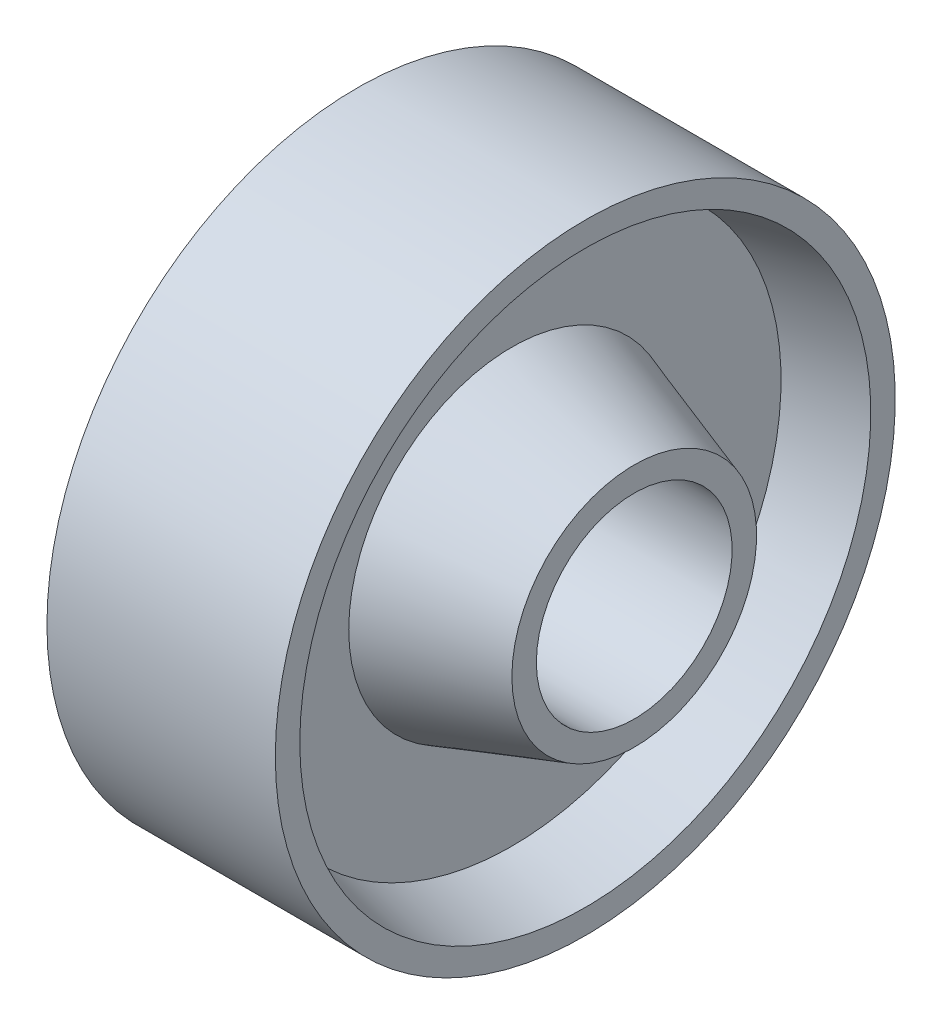
ISO-10303-21;
HEADER;
FILE_DESCRIPTION(('STEP AP214'),'2;1');
FILE_NAME('part.step','',(''),(''),'','','');
FILE_SCHEMA(('AUTOMOTIVE_DESIGN { 1 0 10303 214 1 1 1 1 }'));
ENDSEC;
DATA;
#1=APPLICATION_CONTEXT('core data for automotive mechanical design processes');
#2=APPLICATION_PROTOCOL_DEFINITION('international standard','automotive_design',2000,#1);
#3=PRODUCT_CONTEXT('',#1,'mechanical');
#4=PRODUCT('Part','Part','',(#3));
#5=PRODUCT_RELATED_PRODUCT_CATEGORY('part','',(#4));
#6=PRODUCT_DEFINITION_FORMATION('','',#4);
#7=PRODUCT_DEFINITION_CONTEXT('part definition',#1,'design');
#8=PRODUCT_DEFINITION('design','',#6,#7);
#9=PRODUCT_DEFINITION_SHAPE('','',#8);
#10=(LENGTH_UNIT() NAMED_UNIT(*) SI_UNIT(.MILLI.,.METRE.));
#11=(NAMED_UNIT(*) PLANE_ANGLE_UNIT() SI_UNIT($,.RADIAN.));
#12=(NAMED_UNIT(*) SI_UNIT($,.STERADIAN.) SOLID_ANGLE_UNIT());
#13=UNCERTAINTY_MEASURE_WITH_UNIT(LENGTH_MEASURE(1.E-05),#10,'distance_accuracy_value','');
#14=(GEOMETRIC_REPRESENTATION_CONTEXT(3) GLOBAL_UNCERTAINTY_ASSIGNED_CONTEXT((#13)) GLOBAL_UNIT_ASSIGNED_CONTEXT((#10,
#11,#12)) REPRESENTATION_CONTEXT('',''));
#15=CARTESIAN_POINT('',(0.,0.,0.));
#16=DIRECTION('',(0.,0.,1.));
#17=DIRECTION('',(1.,0.,0.));
#18=AXIS2_PLACEMENT_3D('',#15,#16,#17);
#19=CARTESIAN_POINT('',(-20.,0.,0.));
#20=DIRECTION('',(1.,0.,0.));
#21=DIRECTION('',(0.,0.,-1.));
#22=AXIS2_PLACEMENT_3D('',#19,#20,#21);
#23=PLANE('',#22);
#24=CARTESIAN_POINT('',(-20.,-12.,0.));
#25=DIRECTION('',(-1.,0.,0.));
#26=DIRECTION('',(0.,0.,1.));
#27=AXIS2_PLACEMENT_3D('',#24,#25,#26);
#28=CIRCLE('',#27,12.);
#29=CARTESIAN_POINT('',(-20.,-12.,12.));
#30=VERTEX_POINT('',#29);
#31=EDGE_CURVE('E10',#30,#30,#28,.T.);
#32=ORIENTED_EDGE('',*,*,#31,.F.);
#33=EDGE_LOOP('',(#32));
#34=FACE_BOUND('',#33,.T.);
#35=CARTESIAN_POINT('',(-20.,-12.,0.));
#36=DIRECTION('',(-1.,0.,0.));
#37=DIRECTION('',(0.,0.,1.));
#38=AXIS2_PLACEMENT_3D('',#35,#36,#37);
#39=CIRCLE('',#38,15.);
#40=CARTESIAN_POINT('',(-20.,-12.,15.));
#41=VERTEX_POINT('',#40);
#42=EDGE_CURVE('E40',#41,#41,#39,.T.);
#43=ORIENTED_EDGE('',*,*,#42,.T.);
#44=EDGE_LOOP('',(#43));
#45=FACE_BOUND('',#44,.T.);
#46=ADVANCED_FACE('F34',(#34,#45),#23,.F.);
#47=CARTESIAN_POINT('',(-5.,-12.,0.));
#48=DIRECTION('',(1.,0.,0.));
#49=DIRECTION('',(0.,0.,-1.));
#50=AXIS2_PLACEMENT_3D('',#47,#48,#49);
#51=CONICAL_SURFACE('',#50,20.,0.321750554396642);
#52=ORIENTED_EDGE('',*,*,#42,.F.);
#53=EDGE_LOOP('',(#52));
#54=FACE_BOUND('',#53,.T.);
#55=CARTESIAN_POINT('',(-5.,-12.,0.));
#56=DIRECTION('',(-1.,0.,0.));
#57=DIRECTION('',(0.,0.,1.));
#58=AXIS2_PLACEMENT_3D('',#55,#56,#57);
#59=CIRCLE('',#58,20.);
#60=CARTESIAN_POINT('',(-5.,-12.,20.));
#61=VERTEX_POINT('',#60);
#62=EDGE_CURVE('E44',#61,#61,#59,.T.);
#63=ORIENTED_EDGE('',*,*,#62,.T.);
#64=EDGE_LOOP('',(#63));
#65=FACE_BOUND('',#64,.T.);
#66=ADVANCED_FACE('F90',(#54,#65),#51,.T.);
#67=CARTESIAN_POINT('',(-5.,21.,0.));
#68=DIRECTION('',(1.,0.,0.));
#69=DIRECTION('',(0.,0.,-1.));
#70=AXIS2_PLACEMENT_3D('',#67,#68,#69);
#71=PLANE('',#70);
#72=ORIENTED_EDGE('',*,*,#62,.F.);
#73=EDGE_LOOP('',(#72));
#74=FACE_BOUND('',#73,.T.);
#75=CARTESIAN_POINT('',(-5.,-12.,0.));
#76=DIRECTION('',(-1.,0.,0.));
#77=DIRECTION('',(0.,0.,1.));
#78=AXIS2_PLACEMENT_3D('',#75,#76,#77);
#79=CIRCLE('',#78,33.);
#80=CARTESIAN_POINT('',(-5.,-12.,33.));
#81=VERTEX_POINT('',#80);
#82=EDGE_CURVE('E48',#81,#81,#79,.T.);
#83=ORIENTED_EDGE('',*,*,#82,.T.);
#84=EDGE_LOOP('',(#83));
#85=FACE_BOUND('',#84,.T.);
#86=ADVANCED_FACE('F95',(#74,#85),#71,.F.);
#87=CARTESIAN_POINT('',(-14.,-12.,0.));
#88=DIRECTION('',(-1.,0.,0.));
#89=DIRECTION('',(0.,0.,1.));
#90=AXIS2_PLACEMENT_3D('',#87,#88,#89);
#91=CONICAL_SURFACE('',#90,35.,0.218668945873942);
#92=ORIENTED_EDGE('',*,*,#82,.F.);
#93=EDGE_LOOP('',(#92));
#94=FACE_BOUND('',#93,.T.);
#95=CARTESIAN_POINT('',(-14.,-12.,0.));
#96=DIRECTION('',(-1.,0.,0.));
#97=DIRECTION('',(0.,0.,1.));
#98=AXIS2_PLACEMENT_3D('',#95,#96,#97);
#99=CIRCLE('',#98,35.);
#100=CARTESIAN_POINT('',(-14.,-12.,35.));
#101=VERTEX_POINT('',#100);
#102=EDGE_CURVE('E53',#101,#101,#99,.T.);
#103=ORIENTED_EDGE('',*,*,#102,.T.);
#104=EDGE_LOOP('',(#103));
#105=FACE_BOUND('',#104,.T.);
#106=ADVANCED_FACE('F100',(#94,#105),#91,.F.);
#107=CARTESIAN_POINT('',(-14.,26.,0.));
#108=DIRECTION('',(1.,0.,0.));
#109=DIRECTION('',(0.,0.,-1.));
#110=AXIS2_PLACEMENT_3D('',#107,#108,#109);
#111=PLANE('',#110);
#112=ORIENTED_EDGE('',*,*,#102,.F.);
#113=EDGE_LOOP('',(#112));
#114=FACE_BOUND('',#113,.T.);
#115=CARTESIAN_POINT('',(-14.,-12.,0.));
#116=DIRECTION('',(-1.,0.,0.));
#117=DIRECTION('',(0.,0.,1.));
#118=AXIS2_PLACEMENT_3D('',#115,#116,#117);
#119=CIRCLE('',#118,38.);
#120=CARTESIAN_POINT('',(-14.,-12.,38.));
#121=VERTEX_POINT('',#120);
#122=EDGE_CURVE('E56',#121,#121,#119,.T.);
#123=ORIENTED_EDGE('',*,*,#122,.T.);
#124=EDGE_LOOP('',(#123));
#125=FACE_BOUND('',#124,.T.);
#126=ADVANCED_FACE('F107',(#114,#125),#111,.F.);
#127=CARTESIAN_POINT('',(-20.,-12.,0.));
#128=DIRECTION('',(-1.,0.,0.));
#129=DIRECTION('',(0.,0.,1.));
#130=AXIS2_PLACEMENT_3D('',#127,#128,#129);
#131=CYLINDRICAL_SURFACE('',#130,38.);
#132=ORIENTED_EDGE('',*,*,#122,.F.);
#133=EDGE_LOOP('',(#132));
#134=FACE_BOUND('',#133,.T.);
#135=CARTESIAN_POINT('',(14.,-12.,0.));
#136=DIRECTION('',(-1.,0.,0.));
#137=DIRECTION('',(0.,0.,1.));
#138=AXIS2_PLACEMENT_3D('',#135,#136,#137);
#139=CIRCLE('',#138,38.);
#140=CARTESIAN_POINT('',(14.,-12.,38.));
#141=VERTEX_POINT('',#140);
#142=EDGE_CURVE('E59',#141,#141,#139,.T.);
#143=ORIENTED_EDGE('',*,*,#142,.T.);
#144=EDGE_LOOP('',(#143));
#145=FACE_BOUND('',#144,.T.);
#146=ADVANCED_FACE('F111',(#134,#145),#131,.T.);
#147=CARTESIAN_POINT('',(14.,23.,0.));
#148=DIRECTION('',(-1.,0.,0.));
#149=DIRECTION('',(0.,0.,1.));
#150=AXIS2_PLACEMENT_3D('',#147,#148,#149);
#151=PLANE('',#150);
#152=ORIENTED_EDGE('',*,*,#142,.F.);
#153=EDGE_LOOP('',(#152));
#154=FACE_BOUND('',#153,.T.);
#155=CARTESIAN_POINT('',(14.,-12.,0.));
#156=DIRECTION('',(-1.,0.,0.));
#157=DIRECTION('',(0.,0.,1.));
#158=AXIS2_PLACEMENT_3D('',#155,#156,#157);
#159=CIRCLE('',#158,35.);
#160=CARTESIAN_POINT('',(14.,-12.,35.));
#161=VERTEX_POINT('',#160);
#162=EDGE_CURVE('E62',#161,#161,#159,.T.);
#163=ORIENTED_EDGE('',*,*,#162,.T.);
#164=EDGE_LOOP('',(#163));
#165=FACE_BOUND('',#164,.T.);
#166=ADVANCED_FACE('F115',(#154,#165),#151,.F.);
#167=CARTESIAN_POINT('',(5.,-12.,0.));
#168=DIRECTION('',(1.,0.,0.));
#169=DIRECTION('',(0.,0.,-1.));
#170=AXIS2_PLACEMENT_3D('',#167,#168,#169);
#171=CONICAL_SURFACE('',#170,33.,0.218668945873942);
#172=ORIENTED_EDGE('',*,*,#162,.F.);
#173=EDGE_LOOP('',(#172));
#174=FACE_BOUND('',#173,.T.);
#175=CARTESIAN_POINT('',(5.,-12.,0.));
#176=DIRECTION('',(-1.,0.,0.));
#177=DIRECTION('',(0.,0.,1.));
#178=AXIS2_PLACEMENT_3D('',#175,#176,#177);
#179=CIRCLE('',#178,33.);
#180=CARTESIAN_POINT('',(5.,-12.,33.));
#181=VERTEX_POINT('',#180);
#182=EDGE_CURVE('E65',#181,#181,#179,.T.);
#183=ORIENTED_EDGE('',*,*,#182,.T.);
#184=EDGE_LOOP('',(#183));
#185=FACE_BOUND('',#184,.T.);
#186=ADVANCED_FACE('F119',(#174,#185),#171,.F.);
#187=CARTESIAN_POINT('',(5.,8.00000000000001,0.));
#188=DIRECTION('',(-1.,0.,0.));
#189=DIRECTION('',(0.,0.,1.));
#190=AXIS2_PLACEMENT_3D('',#187,#188,#189);
#191=PLANE('',#190);
#192=ORIENTED_EDGE('',*,*,#182,.F.);
#193=EDGE_LOOP('',(#192));
#194=FACE_BOUND('',#193,.T.);
#195=CARTESIAN_POINT('',(5.,-12.,0.));
#196=DIRECTION('',(-1.,0.,0.));
#197=DIRECTION('',(0.,0.,1.));
#198=AXIS2_PLACEMENT_3D('',#195,#196,#197);
#199=CIRCLE('',#198,20.);
#200=CARTESIAN_POINT('',(5.,-12.,20.));
#201=VERTEX_POINT('',#200);
#202=EDGE_CURVE('E68',#201,#201,#199,.T.);
#203=ORIENTED_EDGE('',*,*,#202,.T.);
#204=EDGE_LOOP('',(#203));
#205=FACE_BOUND('',#204,.T.);
#206=ADVANCED_FACE('F123',(#194,#205),#191,.F.);
#207=CARTESIAN_POINT('',(20.,-12.,0.));
#208=DIRECTION('',(-1.,0.,0.));
#209=DIRECTION('',(0.,0.,1.));
#210=AXIS2_PLACEMENT_3D('',#207,#208,#209);
#211=CONICAL_SURFACE('',#210,15.,0.321750554396643);
#212=ORIENTED_EDGE('',*,*,#202,.F.);
#213=EDGE_LOOP('',(#212));
#214=FACE_BOUND('',#213,.T.);
#215=CARTESIAN_POINT('',(20.,-12.,0.));
#216=DIRECTION('',(-1.,0.,0.));
#217=DIRECTION('',(0.,0.,1.));
#218=AXIS2_PLACEMENT_3D('',#215,#216,#217);
#219=CIRCLE('',#218,15.);
#220=CARTESIAN_POINT('',(20.,-12.,15.));
#221=VERTEX_POINT('',#220);
#222=EDGE_CURVE('E71',#221,#221,#219,.T.);
#223=ORIENTED_EDGE('',*,*,#222,.T.);
#224=EDGE_LOOP('',(#223));
#225=FACE_BOUND('',#224,.T.);
#226=ADVANCED_FACE('F86',(#214,#225),#211,.T.);
#227=CARTESIAN_POINT('',(20.,0.,0.));
#228=DIRECTION('',(-1.,0.,0.));
#229=DIRECTION('',(0.,0.,1.));
#230=AXIS2_PLACEMENT_3D('',#227,#228,#229);
#231=PLANE('',#230);
#232=ORIENTED_EDGE('',*,*,#222,.F.);
#233=EDGE_LOOP('',(#232));
#234=FACE_BOUND('',#233,.T.);
#235=CARTESIAN_POINT('',(20.,-12.,0.));
#236=DIRECTION('',(-1.,0.,0.));
#237=DIRECTION('',(0.,0.,1.));
#238=AXIS2_PLACEMENT_3D('',#235,#236,#237);
#239=CIRCLE('',#238,12.);
#240=CARTESIAN_POINT('',(20.,-12.,12.));
#241=VERTEX_POINT('',#240);
#242=EDGE_CURVE('E74',#241,#241,#239,.T.);
#243=ORIENTED_EDGE('',*,*,#242,.T.);
#244=EDGE_LOOP('',(#243));
#245=FACE_BOUND('',#244,.T.);
#246=ADVANCED_FACE('F78',(#234,#245),#231,.F.);
#247=CARTESIAN_POINT('',(-20.,-12.,0.));
#248=DIRECTION('',(-1.,0.,0.));
#249=DIRECTION('',(0.,0.,1.));
#250=AXIS2_PLACEMENT_3D('',#247,#248,#249);
#251=CYLINDRICAL_SURFACE('',#250,12.);
#252=ORIENTED_EDGE('',*,*,#242,.F.);
#253=EDGE_LOOP('',(#252));
#254=FACE_BOUND('',#253,.T.);
#255=ORIENTED_EDGE('',*,*,#31,.T.);
#256=EDGE_LOOP('',(#255));
#257=FACE_BOUND('',#256,.T.);
#258=ADVANCED_FACE('F80',(#254,#257),#251,.F.);
#259=CLOSED_SHELL('',(#46,#66,#86,#106,#126,#146,#166,#186,#206,#226,#246,#258));
#260=MANIFOLD_SOLID_BREP('B2',#259);
#261=ADVANCED_BREP_SHAPE_REPRESENTATION('',(#18,#260),#14);
#262=SHAPE_DEFINITION_REPRESENTATION(#9,#261);
ENDSEC;
END-ISO-10303-21;
